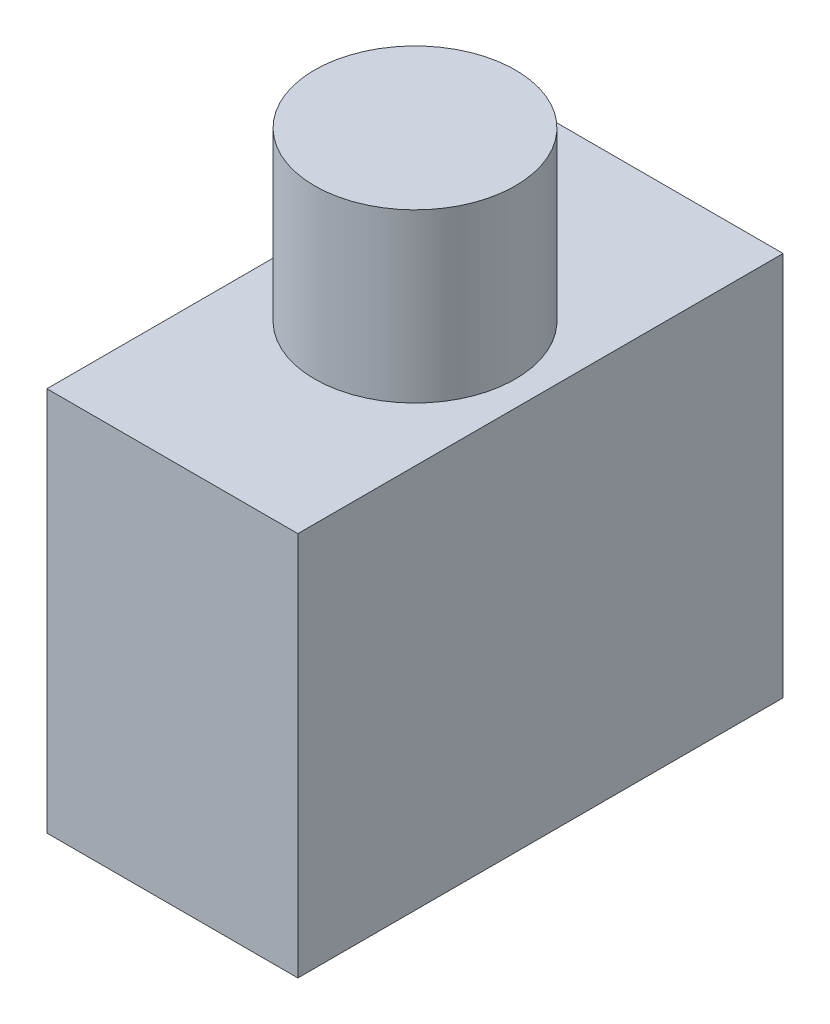
ISO-10303-21;
HEADER;
FILE_DESCRIPTION(('STEP AP214'),'2;1');
FILE_NAME('part.step','',(''),(''),'','','');
FILE_SCHEMA(('AUTOMOTIVE_DESIGN { 1 0 10303 214 1 1 1 1 }'));
ENDSEC;
DATA;
#1=APPLICATION_CONTEXT('core data for automotive mechanical design processes');
#2=APPLICATION_PROTOCOL_DEFINITION('international standard','automotive_design',2000,#1);
#3=PRODUCT_CONTEXT('',#1,'mechanical');
#4=PRODUCT('Part','Part','',(#3));
#5=PRODUCT_RELATED_PRODUCT_CATEGORY('part','',(#4));
#6=PRODUCT_DEFINITION_FORMATION('','',#4);
#7=PRODUCT_DEFINITION_CONTEXT('part definition',#1,'design');
#8=PRODUCT_DEFINITION('design','',#6,#7);
#9=PRODUCT_DEFINITION_SHAPE('','',#8);
#10=(LENGTH_UNIT() NAMED_UNIT(*) SI_UNIT(.MILLI.,.METRE.));
#11=(NAMED_UNIT(*) PLANE_ANGLE_UNIT() SI_UNIT($,.RADIAN.));
#12=(NAMED_UNIT(*) SI_UNIT($,.STERADIAN.) SOLID_ANGLE_UNIT());
#13=UNCERTAINTY_MEASURE_WITH_UNIT(LENGTH_MEASURE(1.E-05),#10,'distance_accuracy_value','');
#14=(GEOMETRIC_REPRESENTATION_CONTEXT(3) GLOBAL_UNCERTAINTY_ASSIGNED_CONTEXT((#13)) GLOBAL_UNIT_ASSIGNED_CONTEXT((#10,
#11,#12)) REPRESENTATION_CONTEXT('',''));
#15=CARTESIAN_POINT('',(0.,0.,0.));
#16=DIRECTION('',(0.,0.,1.));
#17=DIRECTION('',(1.,0.,0.));
#18=AXIS2_PLACEMENT_3D('',#15,#16,#17);
#19=CARTESIAN_POINT('',(7.5,23.,-14.5));
#20=DIRECTION('',(-1.,0.,0.));
#21=DIRECTION('',(0.,0.,1.));
#22=AXIS2_PLACEMENT_3D('',#19,#20,#21);
#23=PLANE('',#22);
#24=DIRECTION('',(0.,0.,-1.));
#25=VECTOR('',#24,1.);
#26=CARTESIAN_POINT('',(7.5,0.,-14.5));
#27=LINE('',#26,#25);
#28=CARTESIAN_POINT('',(7.5,0.,14.5));
#29=VERTEX_POINT('',#28);
#30=CARTESIAN_POINT('',(7.5,0.,-14.5));
#31=VERTEX_POINT('',#30);
#32=EDGE_CURVE('E110',#29,#31,#27,.T.);
#33=ORIENTED_EDGE('',*,*,#32,.T.);
#34=DIRECTION('',(0.,-1.,0.));
#35=VECTOR('',#34,1.);
#36=CARTESIAN_POINT('',(7.5,23.,-14.5));
#37=LINE('',#36,#35);
#38=CARTESIAN_POINT('',(7.5,23.,-14.5));
#39=VERTEX_POINT('',#38);
#40=EDGE_CURVE('E42',#39,#31,#37,.T.);
#41=ORIENTED_EDGE('',*,*,#40,.F.);
#42=DIRECTION('',(0.,0.,-1.));
#43=VECTOR('',#42,1.);
#44=CARTESIAN_POINT('',(7.5,23.,-14.5));
#45=LINE('',#44,#43);
#46=CARTESIAN_POINT('',(7.5,23.,14.5));
#47=VERTEX_POINT('',#46);
#48=EDGE_CURVE('E93',#47,#39,#45,.T.);
#49=ORIENTED_EDGE('',*,*,#48,.F.);
#50=DIRECTION('',(0.,-1.,0.));
#51=VECTOR('',#50,1.);
#52=CARTESIAN_POINT('',(7.5,23.,14.5));
#53=LINE('',#52,#51);
#54=EDGE_CURVE('E106',#47,#29,#53,.T.);
#55=ORIENTED_EDGE('',*,*,#54,.T.);
#56=EDGE_LOOP('',(#33,#41,#49,#55));
#57=FACE_BOUND('',#56,.T.);
#58=ADVANCED_FACE('F39',(#57),#23,.F.);
#59=CARTESIAN_POINT('',(-7.5,23.,-14.5));
#60=DIRECTION('',(0.,0.,1.));
#61=DIRECTION('',(1.,0.,0.));
#62=AXIS2_PLACEMENT_3D('',#59,#60,#61);
#63=PLANE('',#62);
#64=DIRECTION('',(-1.,0.,0.));
#65=VECTOR('',#64,1.);
#66=CARTESIAN_POINT('',(-7.5,0.,-14.5));
#67=LINE('',#66,#65);
#68=CARTESIAN_POINT('',(-7.5,0.,-14.5));
#69=VERTEX_POINT('',#68);
#70=EDGE_CURVE('E99',#31,#69,#67,.T.);
#71=ORIENTED_EDGE('',*,*,#70,.T.);
#72=DIRECTION('',(0.,-1.,0.));
#73=VECTOR('',#72,1.);
#74=CARTESIAN_POINT('',(-7.5,23.,-14.5));
#75=LINE('',#74,#73);
#76=CARTESIAN_POINT('',(-7.5,23.,-14.5));
#77=VERTEX_POINT('',#76);
#78=EDGE_CURVE('E97',#77,#69,#75,.T.);
#79=ORIENTED_EDGE('',*,*,#78,.F.);
#80=DIRECTION('',(-1.,0.,0.));
#81=VECTOR('',#80,1.);
#82=CARTESIAN_POINT('',(-7.5,23.,-14.5));
#83=LINE('',#82,#81);
#84=EDGE_CURVE('E88',#39,#77,#83,.T.);
#85=ORIENTED_EDGE('',*,*,#84,.F.);
#86=ORIENTED_EDGE('',*,*,#40,.T.);
#87=EDGE_LOOP('',(#71,#79,#85,#86));
#88=FACE_BOUND('',#87,.T.);
#89=ADVANCED_FACE('F98',(#88),#63,.F.);
#90=CARTESIAN_POINT('',(-7.5,23.,-14.5));
#91=DIRECTION('',(1.,0.,0.));
#92=DIRECTION('',(0.,0.,-1.));
#93=AXIS2_PLACEMENT_3D('',#90,#91,#92);
#94=PLANE('',#93);
#95=DIRECTION('',(0.,0.,1.));
#96=VECTOR('',#95,1.);
#97=CARTESIAN_POINT('',(-7.5,0.,-14.5));
#98=LINE('',#97,#96);
#99=CARTESIAN_POINT('',(-7.5,0.,14.5));
#100=VERTEX_POINT('',#99);
#101=EDGE_CURVE('E74',#69,#100,#98,.T.);
#102=ORIENTED_EDGE('',*,*,#101,.T.);
#103=DIRECTION('',(0.,-1.,0.));
#104=VECTOR('',#103,1.);
#105=CARTESIAN_POINT('',(-7.5,23.,14.5));
#106=LINE('',#105,#104);
#107=CARTESIAN_POINT('',(-7.5,23.,14.5));
#108=VERTEX_POINT('',#107);
#109=EDGE_CURVE('E101',#108,#100,#106,.T.);
#110=ORIENTED_EDGE('',*,*,#109,.F.);
#111=DIRECTION('',(0.,0.,1.));
#112=VECTOR('',#111,1.);
#113=CARTESIAN_POINT('',(-7.5,23.,-14.5));
#114=LINE('',#113,#112);
#115=EDGE_CURVE('E91',#77,#108,#114,.T.);
#116=ORIENTED_EDGE('',*,*,#115,.F.);
#117=ORIENTED_EDGE('',*,*,#78,.T.);
#118=EDGE_LOOP('',(#102,#110,#116,#117));
#119=FACE_BOUND('',#118,.T.);
#120=ADVANCED_FACE('F102',(#119),#94,.F.);
#121=CARTESIAN_POINT('',(-7.5,23.,14.5));
#122=DIRECTION('',(0.,0.,-1.));
#123=DIRECTION('',(-1.,0.,0.));
#124=AXIS2_PLACEMENT_3D('',#121,#122,#123);
#125=PLANE('',#124);
#126=DIRECTION('',(1.,0.,0.));
#127=VECTOR('',#126,1.);
#128=CARTESIAN_POINT('',(-7.5,0.,14.5));
#129=LINE('',#128,#127);
#130=EDGE_CURVE('E80',#100,#29,#129,.T.);
#131=ORIENTED_EDGE('',*,*,#130,.T.);
#132=ORIENTED_EDGE('',*,*,#54,.F.);
#133=DIRECTION('',(1.,0.,0.));
#134=VECTOR('',#133,1.);
#135=CARTESIAN_POINT('',(-7.5,23.,14.5));
#136=LINE('',#135,#134);
#137=EDGE_CURVE('E57',#108,#47,#136,.T.);
#138=ORIENTED_EDGE('',*,*,#137,.F.);
#139=ORIENTED_EDGE('',*,*,#109,.T.);
#140=EDGE_LOOP('',(#131,#132,#138,#139));
#141=FACE_BOUND('',#140,.T.);
#142=ADVANCED_FACE('F124',(#141),#125,.F.);
#143=CARTESIAN_POINT('',(0.,23.,0.));
#144=DIRECTION('',(0.,1.,0.));
#145=DIRECTION('',(0.,0.,1.));
#146=AXIS2_PLACEMENT_3D('',#143,#144,#145);
#147=PLANE('',#146);
#148=CARTESIAN_POINT('',(0.,23.,0.));
#149=DIRECTION('',(0.,1.,0.));
#150=DIRECTION('',(0.,0.,1.));
#151=AXIS2_PLACEMENT_3D('',#148,#149,#150);
#152=CIRCLE('',#151,6.);
#153=CARTESIAN_POINT('',(0.,23.,6.));
#154=VERTEX_POINT('',#153);
#155=EDGE_CURVE('E11',#154,#154,#152,.T.);
#156=ORIENTED_EDGE('',*,*,#155,.F.);
#157=EDGE_LOOP('',(#156));
#158=FACE_BOUND('',#157,.T.);
#159=ORIENTED_EDGE('',*,*,#48,.T.);
#160=ORIENTED_EDGE('',*,*,#84,.T.);
#161=ORIENTED_EDGE('',*,*,#115,.T.);
#162=ORIENTED_EDGE('',*,*,#137,.T.);
#163=EDGE_LOOP('',(#159,#160,#161,#162));
#164=FACE_BOUND('',#163,.T.);
#165=ADVANCED_FACE('F89',(#158,#164),#147,.T.);
#166=CARTESIAN_POINT('',(0.,0.,0.));
#167=DIRECTION('',(0.,1.,0.));
#168=DIRECTION('',(0.,0.,1.));
#169=AXIS2_PLACEMENT_3D('',#166,#167,#168);
#170=PLANE('',#169);
#171=ORIENTED_EDGE('',*,*,#32,.F.);
#172=ORIENTED_EDGE('',*,*,#130,.F.);
#173=ORIENTED_EDGE('',*,*,#101,.F.);
#174=ORIENTED_EDGE('',*,*,#70,.F.);
#175=EDGE_LOOP('',(#171,#172,#173,#174));
#176=FACE_BOUND('',#175,.T.);
#177=ADVANCED_FACE('F127',(#176),#170,.F.);
#178=CARTESIAN_POINT('',(0.,33.,0.));
#179=DIRECTION('',(0.,-1.,0.));
#180=DIRECTION('',(0.,0.,-1.));
#181=AXIS2_PLACEMENT_3D('',#178,#179,#180);
#182=CYLINDRICAL_SURFACE('',#181,6.);
#183=CARTESIAN_POINT('',(0.,33.,0.));
#184=DIRECTION('',(0.,1.,0.));
#185=DIRECTION('',(0.,0.,1.));
#186=AXIS2_PLACEMENT_3D('',#183,#184,#185);
#187=CIRCLE('',#186,6.);
#188=CARTESIAN_POINT('',(0.,33.,6.));
#189=VERTEX_POINT('',#188);
#190=EDGE_CURVE('E114',#189,#189,#187,.T.);
#191=ORIENTED_EDGE('',*,*,#190,.F.);
#192=EDGE_LOOP('',(#191));
#193=FACE_BOUND('',#192,.T.);
#194=ORIENTED_EDGE('',*,*,#155,.T.);
#195=EDGE_LOOP('',(#194));
#196=FACE_BOUND('',#195,.T.);
#197=ADVANCED_FACE('F137',(#193,#196),#182,.T.);
#198=CARTESIAN_POINT('',(0.,33.,0.));
#199=DIRECTION('',(0.,1.,0.));
#200=DIRECTION('',(0.,0.,1.));
#201=AXIS2_PLACEMENT_3D('',#198,#199,#200);
#202=PLANE('',#201);
#203=ORIENTED_EDGE('',*,*,#190,.T.);
#204=EDGE_LOOP('',(#203));
#205=FACE_BOUND('',#204,.T.);
#206=ADVANCED_FACE('F135',(#205),#202,.T.);
#207=CLOSED_SHELL('',(#58,#89,#120,#142,#165,#177,#197,#206));
#208=MANIFOLD_SOLID_BREP('B2',#207);
#209=ADVANCED_BREP_SHAPE_REPRESENTATION('',(#18,#208),#14);
#210=SHAPE_DEFINITION_REPRESENTATION(#9,#209);
ENDSEC;
END-ISO-10303-21;
